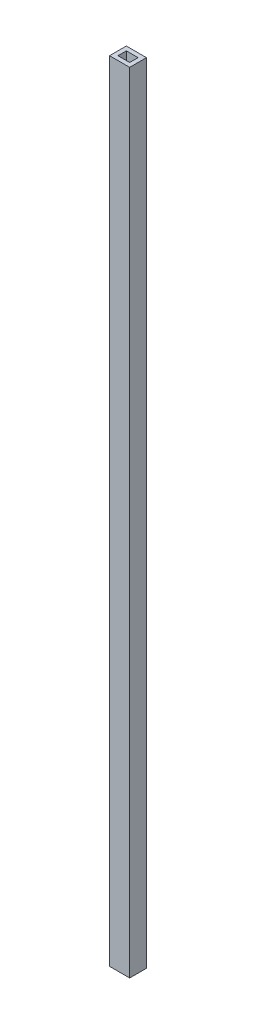
ISO-10303-21;
HEADER;
FILE_DESCRIPTION(('STEP AP214'),'2;1');
FILE_NAME('part.step','',(''),(''),'','','');
FILE_SCHEMA(('AUTOMOTIVE_DESIGN { 1 0 10303 214 1 1 1 1 }'));
ENDSEC;
DATA;
#1=APPLICATION_CONTEXT('core data for automotive mechanical design processes');
#2=APPLICATION_PROTOCOL_DEFINITION('international standard','automotive_design',2000,#1);
#3=PRODUCT_CONTEXT('',#1,'mechanical');
#4=PRODUCT('Part','Part','',(#3));
#5=PRODUCT_RELATED_PRODUCT_CATEGORY('part','',(#4));
#6=PRODUCT_DEFINITION_FORMATION('','',#4);
#7=PRODUCT_DEFINITION_CONTEXT('part definition',#1,'design');
#8=PRODUCT_DEFINITION('design','',#6,#7);
#9=PRODUCT_DEFINITION_SHAPE('','',#8);
#10=(LENGTH_UNIT() NAMED_UNIT(*) SI_UNIT(.MILLI.,.METRE.));
#11=(NAMED_UNIT(*) PLANE_ANGLE_UNIT() SI_UNIT($,.RADIAN.));
#12=(NAMED_UNIT(*) SI_UNIT($,.STERADIAN.) SOLID_ANGLE_UNIT());
#13=UNCERTAINTY_MEASURE_WITH_UNIT(LENGTH_MEASURE(1.E-05),#10,'distance_accuracy_value','');
#14=(GEOMETRIC_REPRESENTATION_CONTEXT(3) GLOBAL_UNCERTAINTY_ASSIGNED_CONTEXT((#13)) GLOBAL_UNIT_ASSIGNED_CONTEXT((#10,
#11,#12)) REPRESENTATION_CONTEXT('',''));
#15=CARTESIAN_POINT('',(0.,0.,0.));
#16=DIRECTION('',(0.,0.,1.));
#17=DIRECTION('',(1.,0.,0.));
#18=AXIS2_PLACEMENT_3D('',#15,#16,#17);
#19=CARTESIAN_POINT('',(0.,596.9,0.));
#20=DIRECTION('',(0.,-1.,0.));
#21=DIRECTION('',(0.,0.,-1.));
#22=AXIS2_PLACEMENT_3D('',#19,#20,#21);
#23=PLANE('',#22);
#24=DIRECTION('',(0.,0.,-1.));
#25=VECTOR('',#24,1.);
#26=CARTESIAN_POINT('',(7.62,596.9,6.35000000000001));
#27=LINE('',#26,#25);
#28=CARTESIAN_POINT('',(7.62,596.9,6.35000000000001));
#29=VERTEX_POINT('',#28);
#30=CARTESIAN_POINT('',(7.62,596.9,-6.34999999999999));
#31=VERTEX_POINT('',#30);
#32=EDGE_CURVE('E145',#29,#31,#27,.T.);
#33=ORIENTED_EDGE('',*,*,#32,.T.);
#34=DIRECTION('',(-1.,0.,0.));
#35=VECTOR('',#34,1.);
#36=CARTESIAN_POINT('',(-7.62,596.9,-6.34999999999999));
#37=LINE('',#36,#35);
#38=CARTESIAN_POINT('',(-7.62,596.9,-6.34999999999999));
#39=VERTEX_POINT('',#38);
#40=EDGE_CURVE('E148',#31,#39,#37,.T.);
#41=ORIENTED_EDGE('',*,*,#40,.T.);
#42=DIRECTION('',(0.,0.,1.));
#43=VECTOR('',#42,1.);
#44=CARTESIAN_POINT('',(-7.62,596.9,6.35000000000001));
#45=LINE('',#44,#43);
#46=CARTESIAN_POINT('',(-7.62,596.9,6.35000000000001));
#47=VERTEX_POINT('',#46);
#48=EDGE_CURVE('E151',#39,#47,#45,.T.);
#49=ORIENTED_EDGE('',*,*,#48,.T.);
#50=DIRECTION('',(1.,0.,0.));
#51=VECTOR('',#50,1.);
#52=CARTESIAN_POINT('',(-7.62,596.9,6.35000000000001));
#53=LINE('',#52,#51);
#54=EDGE_CURVE('E153',#47,#29,#53,.T.);
#55=ORIENTED_EDGE('',*,*,#54,.T.);
#56=EDGE_LOOP('',(#33,#41,#49,#55));
#57=FACE_BOUND('',#56,.T.);
#58=DIRECTION('',(0.,0.,1.));
#59=VECTOR('',#58,1.);
#60=CARTESIAN_POINT('',(-4.445,596.9,3.17500000000001));
#61=LINE('',#60,#59);
#62=CARTESIAN_POINT('',(-4.445,596.9,-3.17499999999999));
#63=VERTEX_POINT('',#62);
#64=CARTESIAN_POINT('',(-4.445,596.9,3.17500000000001));
#65=VERTEX_POINT('',#64);
#66=EDGE_CURVE('E109',#63,#65,#61,.T.);
#67=ORIENTED_EDGE('',*,*,#66,.F.);
#68=DIRECTION('',(-1.,0.,0.));
#69=VECTOR('',#68,1.);
#70=CARTESIAN_POINT('',(-4.445,596.9,-3.17499999999999));
#71=LINE('',#70,#69);
#72=CARTESIAN_POINT('',(4.445,596.9,-3.17499999999999));
#73=VERTEX_POINT('',#72);
#74=EDGE_CURVE('E131',#73,#63,#71,.T.);
#75=ORIENTED_EDGE('',*,*,#74,.F.);
#76=DIRECTION('',(0.,0.,-1.));
#77=VECTOR('',#76,1.);
#78=CARTESIAN_POINT('',(4.445,596.9,3.17500000000001));
#79=LINE('',#78,#77);
#80=CARTESIAN_POINT('',(4.445,596.9,3.17500000000001));
#81=VERTEX_POINT('',#80);
#82=EDGE_CURVE('E129',#81,#73,#79,.T.);
#83=ORIENTED_EDGE('',*,*,#82,.F.);
#84=DIRECTION('',(1.,0.,0.));
#85=VECTOR('',#84,1.);
#86=CARTESIAN_POINT('',(-4.445,596.9,3.17500000000001));
#87=LINE('',#86,#85);
#88=EDGE_CURVE('E117',#65,#81,#87,.T.);
#89=ORIENTED_EDGE('',*,*,#88,.F.);
#90=EDGE_LOOP('',(#67,#75,#83,#89));
#91=FACE_BOUND('',#90,.T.);
#92=ADVANCED_FACE('F44',(#57,#91),#23,.F.);
#93=CARTESIAN_POINT('',(0.,0.,0.));
#94=DIRECTION('',(0.,-1.,0.));
#95=DIRECTION('',(0.,0.,-1.));
#96=AXIS2_PLACEMENT_3D('',#93,#94,#95);
#97=PLANE('',#96);
#98=DIRECTION('',(0.,0.,-1.));
#99=VECTOR('',#98,1.);
#100=CARTESIAN_POINT('',(7.62,0.,6.35000000000001));
#101=LINE('',#100,#99);
#102=CARTESIAN_POINT('',(7.62,0.,6.35000000000001));
#103=VERTEX_POINT('',#102);
#104=CARTESIAN_POINT('',(7.62,0.,-6.34999999999999));
#105=VERTEX_POINT('',#104);
#106=EDGE_CURVE('E125',#103,#105,#101,.T.);
#107=ORIENTED_EDGE('',*,*,#106,.F.);
#108=DIRECTION('',(1.,0.,0.));
#109=VECTOR('',#108,1.);
#110=CARTESIAN_POINT('',(-7.62,0.,6.35000000000001));
#111=LINE('',#110,#109);
#112=CARTESIAN_POINT('',(-7.62,0.,6.35000000000001));
#113=VERTEX_POINT('',#112);
#114=EDGE_CURVE('E149',#113,#103,#111,.T.);
#115=ORIENTED_EDGE('',*,*,#114,.F.);
#116=DIRECTION('',(0.,0.,1.));
#117=VECTOR('',#116,1.);
#118=CARTESIAN_POINT('',(-7.62,0.,6.35000000000001));
#119=LINE('',#118,#117);
#120=CARTESIAN_POINT('',(-7.62,0.,-6.34999999999999));
#121=VERTEX_POINT('',#120);
#122=EDGE_CURVE('E162',#121,#113,#119,.T.);
#123=ORIENTED_EDGE('',*,*,#122,.F.);
#124=DIRECTION('',(-1.,0.,0.));
#125=VECTOR('',#124,1.);
#126=CARTESIAN_POINT('',(-7.62,0.,-6.34999999999999));
#127=LINE('',#126,#125);
#128=EDGE_CURVE('E158',#105,#121,#127,.T.);
#129=ORIENTED_EDGE('',*,*,#128,.F.);
#130=EDGE_LOOP('',(#107,#115,#123,#129));
#131=FACE_BOUND('',#130,.T.);
#132=DIRECTION('',(-1.,0.,0.));
#133=VECTOR('',#132,1.);
#134=CARTESIAN_POINT('',(-4.445,0.,-3.17499999999999));
#135=LINE('',#134,#133);
#136=CARTESIAN_POINT('',(4.445,0.,-3.17499999999999));
#137=VERTEX_POINT('',#136);
#138=CARTESIAN_POINT('',(-4.445,0.,-3.17499999999999));
#139=VERTEX_POINT('',#138);
#140=EDGE_CURVE('E118',#137,#139,#135,.T.);
#141=ORIENTED_EDGE('',*,*,#140,.T.);
#142=DIRECTION('',(0.,0.,1.));
#143=VECTOR('',#142,1.);
#144=CARTESIAN_POINT('',(-4.445,0.,3.17500000000001));
#145=LINE('',#144,#143);
#146=CARTESIAN_POINT('',(-4.445,0.,3.17500000000001));
#147=VERTEX_POINT('',#146);
#148=EDGE_CURVE('E67',#139,#147,#145,.T.);
#149=ORIENTED_EDGE('',*,*,#148,.T.);
#150=DIRECTION('',(1.,0.,0.));
#151=VECTOR('',#150,1.);
#152=CARTESIAN_POINT('',(-4.445,0.,3.17500000000001));
#153=LINE('',#152,#151);
#154=CARTESIAN_POINT('',(4.445,0.,3.17500000000001));
#155=VERTEX_POINT('',#154);
#156=EDGE_CURVE('E124',#147,#155,#153,.T.);
#157=ORIENTED_EDGE('',*,*,#156,.T.);
#158=DIRECTION('',(0.,0.,-1.));
#159=VECTOR('',#158,1.);
#160=CARTESIAN_POINT('',(4.445,0.,3.17500000000001));
#161=LINE('',#160,#159);
#162=EDGE_CURVE('E137',#155,#137,#161,.T.);
#163=ORIENTED_EDGE('',*,*,#162,.T.);
#164=EDGE_LOOP('',(#141,#149,#157,#163));
#165=FACE_BOUND('',#164,.T.);
#166=ADVANCED_FACE('F184',(#131,#165),#97,.T.);
#167=CARTESIAN_POINT('',(7.62,596.9,6.35000000000001));
#168=DIRECTION('',(-1.,0.,0.));
#169=DIRECTION('',(0.,0.,1.));
#170=AXIS2_PLACEMENT_3D('',#167,#168,#169);
#171=PLANE('',#170);
#172=ORIENTED_EDGE('',*,*,#106,.T.);
#173=DIRECTION('',(0.,-1.,0.));
#174=VECTOR('',#173,1.);
#175=CARTESIAN_POINT('',(7.62,596.9,-6.34999999999999));
#176=LINE('',#175,#174);
#177=EDGE_CURVE('E12',#31,#105,#176,.T.);
#178=ORIENTED_EDGE('',*,*,#177,.F.);
#179=ORIENTED_EDGE('',*,*,#32,.F.);
#180=DIRECTION('',(0.,-1.,0.));
#181=VECTOR('',#180,1.);
#182=CARTESIAN_POINT('',(7.62,596.9,6.35000000000001));
#183=LINE('',#182,#181);
#184=EDGE_CURVE('E155',#29,#103,#183,.T.);
#185=ORIENTED_EDGE('',*,*,#184,.T.);
#186=EDGE_LOOP('',(#172,#178,#179,#185));
#187=FACE_BOUND('',#186,.T.);
#188=ADVANCED_FACE('F46',(#187),#171,.F.);
#189=CARTESIAN_POINT('',(-7.62,596.9,-6.34999999999999));
#190=DIRECTION('',(0.,0.,1.));
#191=DIRECTION('',(1.,0.,0.));
#192=AXIS2_PLACEMENT_3D('',#189,#190,#191);
#193=PLANE('',#192);
#194=ORIENTED_EDGE('',*,*,#128,.T.);
#195=DIRECTION('',(0.,-1.,0.));
#196=VECTOR('',#195,1.);
#197=CARTESIAN_POINT('',(-7.62,596.9,-6.34999999999999));
#198=LINE('',#197,#196);
#199=EDGE_CURVE('E52',#39,#121,#198,.T.);
#200=ORIENTED_EDGE('',*,*,#199,.F.);
#201=ORIENTED_EDGE('',*,*,#40,.F.);
#202=ORIENTED_EDGE('',*,*,#177,.T.);
#203=EDGE_LOOP('',(#194,#200,#201,#202));
#204=FACE_BOUND('',#203,.T.);
#205=ADVANCED_FACE('F194',(#204),#193,.F.);
#206=CARTESIAN_POINT('',(-7.62,596.9,6.35000000000001));
#207=DIRECTION('',(1.,0.,0.));
#208=DIRECTION('',(0.,0.,-1.));
#209=AXIS2_PLACEMENT_3D('',#206,#207,#208);
#210=PLANE('',#209);
#211=ORIENTED_EDGE('',*,*,#122,.T.);
#212=DIRECTION('',(0.,-1.,0.));
#213=VECTOR('',#212,1.);
#214=CARTESIAN_POINT('',(-7.62,596.9,6.35000000000001));
#215=LINE('',#214,#213);
#216=EDGE_CURVE('E171',#47,#113,#215,.T.);
#217=ORIENTED_EDGE('',*,*,#216,.F.);
#218=ORIENTED_EDGE('',*,*,#48,.F.);
#219=ORIENTED_EDGE('',*,*,#199,.T.);
#220=EDGE_LOOP('',(#211,#217,#218,#219));
#221=FACE_BOUND('',#220,.T.);
#222=ADVANCED_FACE('F178',(#221),#210,.F.);
#223=CARTESIAN_POINT('',(-7.62,596.9,6.35000000000001));
#224=DIRECTION('',(0.,0.,-1.));
#225=DIRECTION('',(-1.,0.,0.));
#226=AXIS2_PLACEMENT_3D('',#223,#224,#225);
#227=PLANE('',#226);
#228=ORIENTED_EDGE('',*,*,#114,.T.);
#229=ORIENTED_EDGE('',*,*,#184,.F.);
#230=ORIENTED_EDGE('',*,*,#54,.F.);
#231=ORIENTED_EDGE('',*,*,#216,.T.);
#232=EDGE_LOOP('',(#228,#229,#230,#231));
#233=FACE_BOUND('',#232,.T.);
#234=ADVANCED_FACE('F188',(#233),#227,.F.);
#235=CARTESIAN_POINT('',(-4.445,596.9,3.17500000000001));
#236=DIRECTION('',(1.,0.,0.));
#237=DIRECTION('',(0.,0.,-1.));
#238=AXIS2_PLACEMENT_3D('',#235,#236,#237);
#239=PLANE('',#238);
#240=ORIENTED_EDGE('',*,*,#148,.F.);
#241=DIRECTION('',(0.,-1.,0.));
#242=VECTOR('',#241,1.);
#243=CARTESIAN_POINT('',(-4.445,596.9,-3.17499999999999));
#244=LINE('',#243,#242);
#245=EDGE_CURVE('E113',#63,#139,#244,.T.);
#246=ORIENTED_EDGE('',*,*,#245,.F.);
#247=ORIENTED_EDGE('',*,*,#66,.T.);
#248=DIRECTION('',(0.,-1.,0.));
#249=VECTOR('',#248,1.);
#250=CARTESIAN_POINT('',(-4.445,596.9,3.17500000000001));
#251=LINE('',#250,#249);
#252=EDGE_CURVE('E112',#65,#147,#251,.T.);
#253=ORIENTED_EDGE('',*,*,#252,.T.);
#254=EDGE_LOOP('',(#240,#246,#247,#253));
#255=FACE_BOUND('',#254,.T.);
#256=ADVANCED_FACE('F111',(#255),#239,.T.);
#257=CARTESIAN_POINT('',(-4.445,596.9,3.17500000000001));
#258=DIRECTION('',(0.,0.,-1.));
#259=DIRECTION('',(-1.,0.,0.));
#260=AXIS2_PLACEMENT_3D('',#257,#258,#259);
#261=PLANE('',#260);
#262=ORIENTED_EDGE('',*,*,#156,.F.);
#263=ORIENTED_EDGE('',*,*,#252,.F.);
#264=ORIENTED_EDGE('',*,*,#88,.T.);
#265=DIRECTION('',(0.,-1.,0.));
#266=VECTOR('',#265,1.);
#267=CARTESIAN_POINT('',(4.445,596.9,3.17500000000001));
#268=LINE('',#267,#266);
#269=EDGE_CURVE('E126',#81,#155,#268,.T.);
#270=ORIENTED_EDGE('',*,*,#269,.T.);
#271=EDGE_LOOP('',(#262,#263,#264,#270));
#272=FACE_BOUND('',#271,.T.);
#273=ADVANCED_FACE('F121',(#272),#261,.T.);
#274=CARTESIAN_POINT('',(4.445,596.9,3.17500000000001));
#275=DIRECTION('',(-1.,0.,0.));
#276=DIRECTION('',(0.,0.,1.));
#277=AXIS2_PLACEMENT_3D('',#274,#275,#276);
#278=PLANE('',#277);
#279=ORIENTED_EDGE('',*,*,#162,.F.);
#280=ORIENTED_EDGE('',*,*,#269,.F.);
#281=ORIENTED_EDGE('',*,*,#82,.T.);
#282=DIRECTION('',(0.,-1.,0.));
#283=VECTOR('',#282,1.);
#284=CARTESIAN_POINT('',(4.445,596.9,-3.17499999999999));
#285=LINE('',#284,#283);
#286=EDGE_CURVE('E59',#73,#137,#285,.T.);
#287=ORIENTED_EDGE('',*,*,#286,.T.);
#288=EDGE_LOOP('',(#279,#280,#281,#287));
#289=FACE_BOUND('',#288,.T.);
#290=ADVANCED_FACE('F217',(#289),#278,.T.);
#291=CARTESIAN_POINT('',(-4.445,596.9,-3.17499999999999));
#292=DIRECTION('',(0.,0.,1.));
#293=DIRECTION('',(1.,0.,0.));
#294=AXIS2_PLACEMENT_3D('',#291,#292,#293);
#295=PLANE('',#294);
#296=ORIENTED_EDGE('',*,*,#140,.F.);
#297=ORIENTED_EDGE('',*,*,#286,.F.);
#298=ORIENTED_EDGE('',*,*,#74,.T.);
#299=ORIENTED_EDGE('',*,*,#245,.T.);
#300=EDGE_LOOP('',(#296,#297,#298,#299));
#301=FACE_BOUND('',#300,.T.);
#302=ADVANCED_FACE('F221',(#301),#295,.T.);
#303=CLOSED_SHELL('',(#92,#166,#188,#205,#222,#234,#256,#273,#290,#302));
#304=MANIFOLD_SOLID_BREP('B2',#303);
#305=ADVANCED_BREP_SHAPE_REPRESENTATION('',(#18,#304),#14);
#306=SHAPE_DEFINITION_REPRESENTATION(#9,#305);
ENDSEC;
END-ISO-10303-21;
